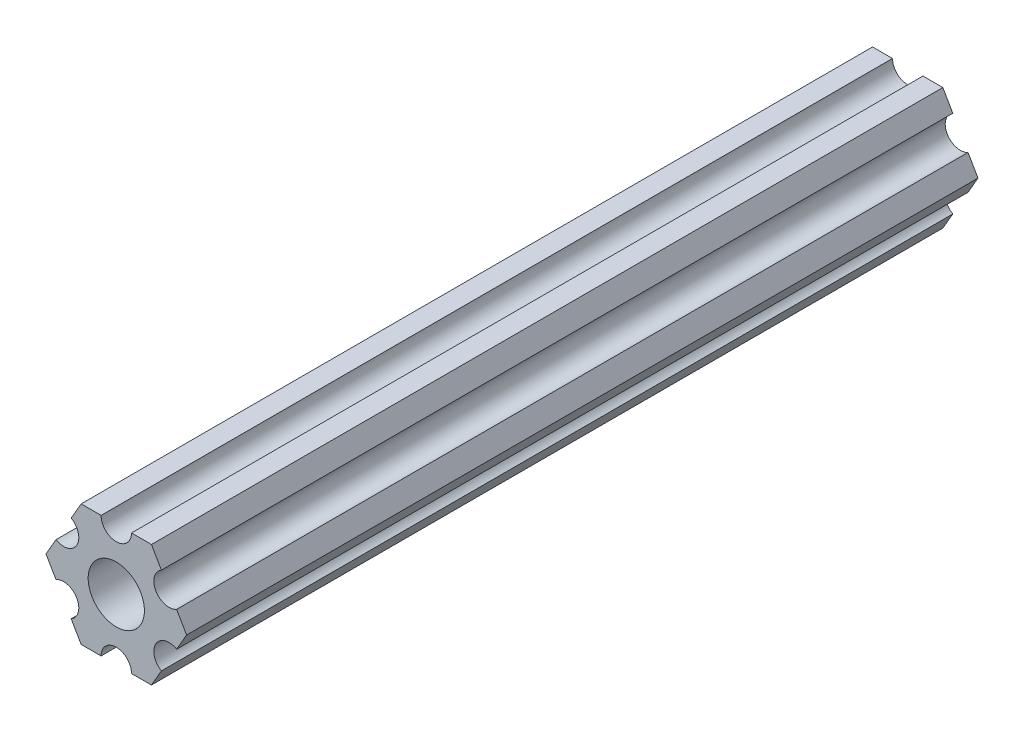
ISO-10303-21;
HEADER;
FILE_DESCRIPTION(('STEP AP214'),'2;1');
FILE_NAME('part.step','',(''),(''),'','','');
FILE_SCHEMA(('AUTOMOTIVE_DESIGN { 1 0 10303 214 1 1 1 1 }'));
ENDSEC;
DATA;
#1=APPLICATION_CONTEXT('core data for automotive mechanical design processes');
#2=APPLICATION_PROTOCOL_DEFINITION('international standard','automotive_design',2000,#1);
#3=PRODUCT_CONTEXT('',#1,'mechanical');
#4=PRODUCT('Part','Part','',(#3));
#5=PRODUCT_RELATED_PRODUCT_CATEGORY('part','',(#4));
#6=PRODUCT_DEFINITION_FORMATION('','',#4);
#7=PRODUCT_DEFINITION_CONTEXT('part definition',#1,'design');
#8=PRODUCT_DEFINITION('design','',#6,#7);
#9=PRODUCT_DEFINITION_SHAPE('','',#8);
#10=(LENGTH_UNIT() NAMED_UNIT(*) SI_UNIT(.MILLI.,.METRE.));
#11=(NAMED_UNIT(*) PLANE_ANGLE_UNIT() SI_UNIT($,.RADIAN.));
#12=(NAMED_UNIT(*) SI_UNIT($,.STERADIAN.) SOLID_ANGLE_UNIT());
#13=UNCERTAINTY_MEASURE_WITH_UNIT(LENGTH_MEASURE(1.E-05),#10,'distance_accuracy_value','');
#14=(GEOMETRIC_REPRESENTATION_CONTEXT(3) GLOBAL_UNCERTAINTY_ASSIGNED_CONTEXT((#13)) GLOBAL_UNIT_ASSIGNED_CONTEXT((#10,
#11,#12)) REPRESENTATION_CONTEXT('',''));
#15=CARTESIAN_POINT('',(0.,0.,0.));
#16=DIRECTION('',(0.,0.,1.));
#17=DIRECTION('',(1.,0.,0.));
#18=AXIS2_PLACEMENT_3D('',#15,#16,#17);
#19=CARTESIAN_POINT('',(5.49926131403118,3.175,82.55));
#20=DIRECTION('',(0.,0.,1.));
#21=DIRECTION('',(1.,0.,0.));
#22=AXIS2_PLACEMENT_3D('',#19,#20,#21);
#23=PLANE('',#22);
#24=DIRECTION('',(0.499999999999995,0.866025403784441,0.));
#25=VECTOR('',#24,1.);
#26=CARTESIAN_POINT('',(6.29301131403117,-1.8001846714922,82.55));
#27=LINE('',#26,#25);
#28=CARTESIAN_POINT('',(6.29301131403117,-1.8001846714922,82.55));
#29=VERTEX_POINT('',#28);
#30=CARTESIAN_POINT('',(7.33234841870821,0.,82.55));
#31=VERTEX_POINT('',#30);
#32=EDGE_CURVE('E231',#29,#31,#27,.T.);
#33=ORIENTED_EDGE('',*,*,#32,.T.);
#34=DIRECTION('',(-0.500000000000001,0.866025403784438,0.));
#35=VECTOR('',#34,1.);
#36=CARTESIAN_POINT('',(7.33234841870821,0.,82.55));
#37=LINE('',#36,#35);
#38=CARTESIAN_POINT('',(6.29301131403114,1.80018467149222,82.55));
#39=VERTEX_POINT('',#38);
#40=EDGE_CURVE('E129',#31,#39,#37,.T.);
#41=ORIENTED_EDGE('',*,*,#40,.T.);
#42=CARTESIAN_POINT('',(5.49926131403118,3.175,82.55));
#43=DIRECTION('',(0.,0.,-1.));
#44=DIRECTION('',(1.,0.,0.));
#45=AXIS2_PLACEMENT_3D('',#42,#43,#44);
#46=CIRCLE('',#45,1.58749999999997);
#47=CARTESIAN_POINT('',(4.70551131403117,4.54981532850775,82.55));
#48=VERTEX_POINT('',#47);
#49=EDGE_CURVE('E276',#39,#48,#46,.T.);
#50=ORIENTED_EDGE('',*,*,#49,.T.);
#51=DIRECTION('',(-0.500000000000001,0.866025403784438,0.));
#52=VECTOR('',#51,1.);
#53=CARTESIAN_POINT('',(4.70551131403117,4.54981532850775,82.55));
#54=LINE('',#53,#52);
#55=CARTESIAN_POINT('',(3.66617420935409,6.34999999999998,82.55));
#56=VERTEX_POINT('',#55);
#57=EDGE_CURVE('E295',#48,#56,#54,.T.);
#58=ORIENTED_EDGE('',*,*,#57,.T.);
#59=DIRECTION('',(-1.,0.,0.));
#60=VECTOR('',#59,1.);
#61=CARTESIAN_POINT('',(3.66617420935409,6.34999999999998,82.55));
#62=LINE('',#61,#60);
#63=CARTESIAN_POINT('',(1.58749999999997,6.34999999999997,82.55));
#64=VERTEX_POINT('',#63);
#65=EDGE_CURVE('E292',#56,#64,#62,.T.);
#66=ORIENTED_EDGE('',*,*,#65,.T.);
#67=CARTESIAN_POINT('',(0.,6.35,82.55));
#68=DIRECTION('',(0.,0.,-1.));
#69=DIRECTION('',(1.,0.,0.));
#70=AXIS2_PLACEMENT_3D('',#67,#68,#69);
#71=CIRCLE('',#70,1.5875);
#72=CARTESIAN_POINT('',(-1.5875,6.34999999999996,82.55));
#73=VERTEX_POINT('',#72);
#74=EDGE_CURVE('E294',#64,#73,#71,.T.);
#75=ORIENTED_EDGE('',*,*,#74,.T.);
#76=DIRECTION('',(-1.,0.,0.));
#77=VECTOR('',#76,1.);
#78=CARTESIAN_POINT('',(-1.58750000000003,6.34999999999996,82.55));
#79=LINE('',#78,#77);
#80=CARTESIAN_POINT('',(-3.66617420935413,6.34999999999995,82.55));
#81=VERTEX_POINT('',#80);
#82=EDGE_CURVE('E297',#73,#81,#79,.T.);
#83=ORIENTED_EDGE('',*,*,#82,.T.);
#84=DIRECTION('',(-0.499999999999995,-0.866025403784442,0.));
#85=VECTOR('',#84,1.);
#86=CARTESIAN_POINT('',(-3.66617420935413,6.34999999999995,82.55));
#87=LINE('',#86,#85);
#88=CARTESIAN_POINT('',(-4.70551131403113,4.54981532850783,82.55));
#89=VERTEX_POINT('',#88);
#90=EDGE_CURVE('E303',#81,#89,#87,.T.);
#91=ORIENTED_EDGE('',*,*,#90,.T.);
#92=CARTESIAN_POINT('',(-5.49926131403119,3.175,82.55));
#93=DIRECTION('',(0.,0.,-1.));
#94=DIRECTION('',(1.,0.,0.));
#95=AXIS2_PLACEMENT_3D('',#92,#93,#94);
#96=CIRCLE('',#95,1.5875);
#97=CARTESIAN_POINT('',(-6.29301131403115,1.80018467149218,82.55));
#98=VERTEX_POINT('',#97);
#99=EDGE_CURVE('E305',#89,#98,#96,.T.);
#100=ORIENTED_EDGE('',*,*,#99,.T.);
#101=DIRECTION('',(-0.499999999999995,-0.866025403784442,0.));
#102=VECTOR('',#101,1.);
#103=CARTESIAN_POINT('',(-6.29301131403112,1.80018467149222,82.55));
#104=LINE('',#103,#102);
#105=CARTESIAN_POINT('',(-7.33234841870821,0.,82.55));
#106=VERTEX_POINT('',#105);
#107=EDGE_CURVE('E307',#98,#106,#104,.T.);
#108=ORIENTED_EDGE('',*,*,#107,.T.);
#109=DIRECTION('',(0.500000000000007,-0.866025403784435,0.));
#110=VECTOR('',#109,1.);
#111=CARTESIAN_POINT('',(-7.33234841870821,0.,82.55));
#112=LINE('',#111,#110);
#113=CARTESIAN_POINT('',(-6.29301131403118,-1.80018467149216,82.55));
#114=VERTEX_POINT('',#113);
#115=EDGE_CURVE('E309',#106,#114,#112,.T.);
#116=ORIENTED_EDGE('',*,*,#115,.T.);
#117=CARTESIAN_POINT('',(-5.49926131403118,-3.175,82.55));
#118=DIRECTION('',(0.,0.,-1.));
#119=DIRECTION('',(1.,0.,0.));
#120=AXIS2_PLACEMENT_3D('',#117,#118,#119);
#121=CIRCLE('',#120,1.5875);
#122=CARTESIAN_POINT('',(-4.70551131403114,-4.54981532850777,82.55));
#123=VERTEX_POINT('',#122);
#124=EDGE_CURVE('E311',#114,#123,#121,.T.);
#125=ORIENTED_EDGE('',*,*,#124,.T.);
#126=DIRECTION('',(0.500000000000007,-0.866025403784435,0.));
#127=VECTOR('',#126,1.);
#128=CARTESIAN_POINT('',(-4.70551131403116,-4.54981532850774,82.55));
#129=LINE('',#128,#127);
#130=CARTESIAN_POINT('',(-3.66617420935405,-6.35,82.55));
#131=VERTEX_POINT('',#130);
#132=EDGE_CURVE('E313',#123,#131,#129,.T.);
#133=ORIENTED_EDGE('',*,*,#132,.T.);
#134=DIRECTION('',(1.,0.,0.));
#135=VECTOR('',#134,1.);
#136=CARTESIAN_POINT('',(-3.66617420935405,-6.35,82.55));
#137=LINE('',#136,#135);
#138=CARTESIAN_POINT('',(-1.58750000000002,-6.34999999999998,82.55));
#139=VERTEX_POINT('',#138);
#140=EDGE_CURVE('E315',#131,#139,#137,.T.);
#141=ORIENTED_EDGE('',*,*,#140,.T.);
#142=CARTESIAN_POINT('',(0.,-6.34999999999996,82.55));
#143=DIRECTION('',(0.,0.,-1.));
#144=DIRECTION('',(1.,0.,0.));
#145=AXIS2_PLACEMENT_3D('',#142,#143,#144);
#146=CIRCLE('',#145,1.5875);
#147=CARTESIAN_POINT('',(1.58749999999998,-6.34999999999995,82.55));
#148=VERTEX_POINT('',#147);
#149=EDGE_CURVE('E178',#139,#148,#146,.T.);
#150=ORIENTED_EDGE('',*,*,#149,.T.);
#151=DIRECTION('',(1.,0.,0.));
#152=VECTOR('',#151,1.);
#153=CARTESIAN_POINT('',(1.58749999999998,-6.34999999999995,82.55));
#154=LINE('',#153,#152);
#155=CARTESIAN_POINT('',(3.66617420935418,-6.34999999999992,82.55));
#156=VERTEX_POINT('',#155);
#157=EDGE_CURVE('E172',#148,#156,#154,.T.);
#158=ORIENTED_EDGE('',*,*,#157,.T.);
#159=DIRECTION('',(0.499999999999995,0.866025403784442,0.));
#160=VECTOR('',#159,1.);
#161=CARTESIAN_POINT('',(3.66617420935418,-6.34999999999992,82.55));
#162=LINE('',#161,#160);
#163=CARTESIAN_POINT('',(4.70551131403118,-4.5498153285078,82.55));
#164=VERTEX_POINT('',#163);
#165=EDGE_CURVE('E176',#156,#164,#162,.T.);
#166=ORIENTED_EDGE('',*,*,#165,.T.);
#167=CARTESIAN_POINT('',(5.49926131403115,-3.17499999999999,82.55));
#168=DIRECTION('',(0.,0.,-1.));
#169=DIRECTION('',(1.,0.,0.));
#170=AXIS2_PLACEMENT_3D('',#167,#168,#169);
#171=CIRCLE('',#170,1.5875);
#172=EDGE_CURVE('E56',#164,#29,#171,.T.);
#173=ORIENTED_EDGE('',*,*,#172,.T.);
#174=EDGE_LOOP('',(#33,#41,#50,#58,#66,#75,#83,#91,#100,#108,#116,#125,#133,#141,#150,#158,#166,#173));
#175=FACE_BOUND('',#174,.T.);
#176=CARTESIAN_POINT('',(0.,0.,82.55));
#177=DIRECTION('',(0.,0.,1.));
#178=DIRECTION('',(1.,0.,0.));
#179=AXIS2_PLACEMENT_3D('',#176,#177,#178);
#180=CIRCLE('',#179,2.9337);
#181=CARTESIAN_POINT('',(2.9337,0.,82.55));
#182=VERTEX_POINT('',#181);
#183=EDGE_CURVE('E200',#182,#182,#180,.T.);
#184=ORIENTED_EDGE('',*,*,#183,.F.);
#185=EDGE_LOOP('',(#184));
#186=FACE_BOUND('',#185,.T.);
#187=ADVANCED_FACE('F39',(#175,#186),#23,.T.);
#188=CARTESIAN_POINT('',(5.49926131403118,3.175,0.));
#189=DIRECTION('',(0.,0.,1.));
#190=DIRECTION('',(1.,0.,0.));
#191=AXIS2_PLACEMENT_3D('',#188,#189,#190);
#192=PLANE('',#191);
#193=DIRECTION('',(0.499999999999995,0.866025403784441,0.));
#194=VECTOR('',#193,1.);
#195=CARTESIAN_POINT('',(6.29301131403117,-1.8001846714922,0.));
#196=LINE('',#195,#194);
#197=CARTESIAN_POINT('',(6.29301131403117,-1.8001846714922,0.));
#198=VERTEX_POINT('',#197);
#199=CARTESIAN_POINT('',(7.33234841870821,0.,0.));
#200=VERTEX_POINT('',#199);
#201=EDGE_CURVE('E196',#198,#200,#196,.T.);
#202=ORIENTED_EDGE('',*,*,#201,.F.);
#203=CARTESIAN_POINT('',(5.49926131403115,-3.17499999999999,0.));
#204=DIRECTION('',(0.,0.,-1.));
#205=DIRECTION('',(1.,0.,0.));
#206=AXIS2_PLACEMENT_3D('',#203,#204,#205);
#207=CIRCLE('',#206,1.5875);
#208=CARTESIAN_POINT('',(4.70551131403118,-4.5498153285078,0.));
#209=VERTEX_POINT('',#208);
#210=EDGE_CURVE('E121',#209,#198,#207,.T.);
#211=ORIENTED_EDGE('',*,*,#210,.F.);
#212=DIRECTION('',(0.499999999999995,0.866025403784442,0.));
#213=VECTOR('',#212,1.);
#214=CARTESIAN_POINT('',(3.66617420935418,-6.34999999999992,0.));
#215=LINE('',#214,#213);
#216=CARTESIAN_POINT('',(3.66617420935418,-6.34999999999992,0.));
#217=VERTEX_POINT('',#216);
#218=EDGE_CURVE('E115',#217,#209,#215,.T.);
#219=ORIENTED_EDGE('',*,*,#218,.F.);
#220=DIRECTION('',(1.,0.,0.));
#221=VECTOR('',#220,1.);
#222=CARTESIAN_POINT('',(1.58749999999998,-6.34999999999995,0.));
#223=LINE('',#222,#221);
#224=CARTESIAN_POINT('',(1.58749999999998,-6.34999999999995,0.));
#225=VERTEX_POINT('',#224);
#226=EDGE_CURVE('E186',#225,#217,#223,.T.);
#227=ORIENTED_EDGE('',*,*,#226,.F.);
#228=CARTESIAN_POINT('',(0.,-6.34999999999996,0.));
#229=DIRECTION('',(0.,0.,-1.));
#230=DIRECTION('',(1.,0.,0.));
#231=AXIS2_PLACEMENT_3D('',#228,#229,#230);
#232=CIRCLE('',#231,1.5875);
#233=CARTESIAN_POINT('',(-1.58750000000002,-6.34999999999998,0.));
#234=VERTEX_POINT('',#233);
#235=EDGE_CURVE('E226',#234,#225,#232,.T.);
#236=ORIENTED_EDGE('',*,*,#235,.F.);
#237=DIRECTION('',(1.,0.,0.));
#238=VECTOR('',#237,1.);
#239=CARTESIAN_POINT('',(-3.66617420935405,-6.35,0.));
#240=LINE('',#239,#238);
#241=CARTESIAN_POINT('',(-3.66617420935405,-6.35,0.));
#242=VERTEX_POINT('',#241);
#243=EDGE_CURVE('E224',#242,#234,#240,.T.);
#244=ORIENTED_EDGE('',*,*,#243,.F.);
#245=DIRECTION('',(0.500000000000007,-0.866025403784435,0.));
#246=VECTOR('',#245,1.);
#247=CARTESIAN_POINT('',(-4.70551131403116,-4.54981532850774,0.));
#248=LINE('',#247,#246);
#249=CARTESIAN_POINT('',(-4.70551131403114,-4.54981532850777,0.));
#250=VERTEX_POINT('',#249);
#251=EDGE_CURVE('E222',#250,#242,#248,.T.);
#252=ORIENTED_EDGE('',*,*,#251,.F.);
#253=CARTESIAN_POINT('',(-5.49926131403118,-3.175,0.));
#254=DIRECTION('',(0.,0.,-1.));
#255=DIRECTION('',(1.,0.,0.));
#256=AXIS2_PLACEMENT_3D('',#253,#254,#255);
#257=CIRCLE('',#256,1.5875);
#258=CARTESIAN_POINT('',(-6.29301131403118,-1.80018467149216,0.));
#259=VERTEX_POINT('',#258);
#260=EDGE_CURVE('E220',#259,#250,#257,.T.);
#261=ORIENTED_EDGE('',*,*,#260,.F.);
#262=DIRECTION('',(0.500000000000007,-0.866025403784435,0.));
#263=VECTOR('',#262,1.);
#264=CARTESIAN_POINT('',(-7.33234841870821,0.,0.));
#265=LINE('',#264,#263);
#266=CARTESIAN_POINT('',(-7.33234841870821,0.,0.));
#267=VERTEX_POINT('',#266);
#268=EDGE_CURVE('E218',#267,#259,#265,.T.);
#269=ORIENTED_EDGE('',*,*,#268,.F.);
#270=DIRECTION('',(-0.499999999999995,-0.866025403784442,0.));
#271=VECTOR('',#270,1.);
#272=CARTESIAN_POINT('',(-6.29301131403112,1.80018467149222,0.));
#273=LINE('',#272,#271);
#274=CARTESIAN_POINT('',(-6.29301131403115,1.80018467149218,0.));
#275=VERTEX_POINT('',#274);
#276=EDGE_CURVE('E216',#275,#267,#273,.T.);
#277=ORIENTED_EDGE('',*,*,#276,.F.);
#278=CARTESIAN_POINT('',(-5.49926131403119,3.175,0.));
#279=DIRECTION('',(0.,0.,-1.));
#280=DIRECTION('',(1.,0.,0.));
#281=AXIS2_PLACEMENT_3D('',#278,#279,#280);
#282=CIRCLE('',#281,1.5875);
#283=CARTESIAN_POINT('',(-4.70551131403113,4.54981532850783,0.));
#284=VERTEX_POINT('',#283);
#285=EDGE_CURVE('E214',#284,#275,#282,.T.);
#286=ORIENTED_EDGE('',*,*,#285,.F.);
#287=DIRECTION('',(-0.499999999999995,-0.866025403784442,0.));
#288=VECTOR('',#287,1.);
#289=CARTESIAN_POINT('',(-3.66617420935413,6.34999999999995,0.));
#290=LINE('',#289,#288);
#291=CARTESIAN_POINT('',(-3.66617420935413,6.34999999999995,0.));
#292=VERTEX_POINT('',#291);
#293=EDGE_CURVE('E212',#292,#284,#290,.T.);
#294=ORIENTED_EDGE('',*,*,#293,.F.);
#295=DIRECTION('',(-1.,0.,0.));
#296=VECTOR('',#295,1.);
#297=CARTESIAN_POINT('',(-1.58750000000003,6.34999999999996,0.));
#298=LINE('',#297,#296);
#299=CARTESIAN_POINT('',(-1.5875,6.34999999999996,0.));
#300=VERTEX_POINT('',#299);
#301=EDGE_CURVE('E210',#300,#292,#298,.T.);
#302=ORIENTED_EDGE('',*,*,#301,.F.);
#303=CARTESIAN_POINT('',(0.,6.35,0.));
#304=DIRECTION('',(0.,0.,-1.));
#305=DIRECTION('',(1.,0.,0.));
#306=AXIS2_PLACEMENT_3D('',#303,#304,#305);
#307=CIRCLE('',#306,1.5875);
#308=CARTESIAN_POINT('',(1.58749999999997,6.34999999999997,0.));
#309=VERTEX_POINT('',#308);
#310=EDGE_CURVE('E208',#309,#300,#307,.T.);
#311=ORIENTED_EDGE('',*,*,#310,.F.);
#312=DIRECTION('',(-1.,0.,0.));
#313=VECTOR('',#312,1.);
#314=CARTESIAN_POINT('',(3.66617420935409,6.34999999999998,0.));
#315=LINE('',#314,#313);
#316=CARTESIAN_POINT('',(3.66617420935409,6.34999999999998,0.));
#317=VERTEX_POINT('',#316);
#318=EDGE_CURVE('E206',#317,#309,#315,.T.);
#319=ORIENTED_EDGE('',*,*,#318,.F.);
#320=DIRECTION('',(-0.500000000000001,0.866025403784438,0.));
#321=VECTOR('',#320,1.);
#322=CARTESIAN_POINT('',(4.70551131403117,4.54981532850775,0.));
#323=LINE('',#322,#321);
#324=CARTESIAN_POINT('',(4.70551131403117,4.54981532850775,0.));
#325=VERTEX_POINT('',#324);
#326=EDGE_CURVE('E204',#325,#317,#323,.T.);
#327=ORIENTED_EDGE('',*,*,#326,.F.);
#328=CARTESIAN_POINT('',(5.49926131403118,3.175,0.));
#329=DIRECTION('',(0.,0.,-1.));
#330=DIRECTION('',(1.,0.,0.));
#331=AXIS2_PLACEMENT_3D('',#328,#329,#330);
#332=CIRCLE('',#331,1.58749999999997);
#333=CARTESIAN_POINT('',(6.29301131403114,1.80018467149222,0.));
#334=VERTEX_POINT('',#333);
#335=EDGE_CURVE('E202',#334,#325,#332,.T.);
#336=ORIENTED_EDGE('',*,*,#335,.F.);
#337=DIRECTION('',(-0.500000000000001,0.866025403784438,0.));
#338=VECTOR('',#337,1.);
#339=CARTESIAN_POINT('',(7.33234841870821,0.,0.));
#340=LINE('',#339,#338);
#341=EDGE_CURVE('E199',#200,#334,#340,.T.);
#342=ORIENTED_EDGE('',*,*,#341,.F.);
#343=EDGE_LOOP('',(#202,#211,#219,#227,#236,#244,#252,#261,#269,#277,#286,#294,#302,#311,#319,
#327,#336,#342));
#344=FACE_BOUND('',#343,.T.);
#345=CARTESIAN_POINT('',(0.,0.,0.));
#346=DIRECTION('',(0.,0.,1.));
#347=DIRECTION('',(1.,0.,0.));
#348=AXIS2_PLACEMENT_3D('',#345,#346,#347);
#349=CIRCLE('',#348,2.9337);
#350=CARTESIAN_POINT('',(2.9337,0.,0.));
#351=VERTEX_POINT('',#350);
#352=EDGE_CURVE('E540',#351,#351,#349,.T.);
#353=ORIENTED_EDGE('',*,*,#352,.T.);
#354=EDGE_LOOP('',(#353));
#355=FACE_BOUND('',#354,.T.);
#356=ADVANCED_FACE('F280',(#344,#355),#192,.F.);
#357=CARTESIAN_POINT('',(6.29301131403117,-1.8001846714922,82.55));
#358=DIRECTION('',(-0.866025403784441,0.499999999999995,0.));
#359=DIRECTION('',(-0.499999999999995,-0.866025403784442,0.));
#360=AXIS2_PLACEMENT_3D('',#357,#358,#359);
#361=PLANE('',#360);
#362=ORIENTED_EDGE('',*,*,#201,.T.);
#363=DIRECTION('',(0.,0.,-1.));
#364=VECTOR('',#363,1.);
#365=CARTESIAN_POINT('',(7.33234841870821,0.,82.55));
#366=LINE('',#365,#364);
#367=EDGE_CURVE('E11',#31,#200,#366,.T.);
#368=ORIENTED_EDGE('',*,*,#367,.F.);
#369=ORIENTED_EDGE('',*,*,#32,.F.);
#370=DIRECTION('',(0.,0.,-1.));
#371=VECTOR('',#370,1.);
#372=CARTESIAN_POINT('',(6.29301131403117,-1.8001846714922,82.55));
#373=LINE('',#372,#371);
#374=EDGE_CURVE('E192',#29,#198,#373,.T.);
#375=ORIENTED_EDGE('',*,*,#374,.T.);
#376=EDGE_LOOP('',(#362,#368,#369,#375));
#377=FACE_BOUND('',#376,.T.);
#378=ADVANCED_FACE('F41',(#377),#361,.F.);
#379=CARTESIAN_POINT('',(7.33234841870821,0.,82.55));
#380=DIRECTION('',(-0.866025403784438,-0.500000000000001,0.));
#381=DIRECTION('',(0.500000000000001,-0.866025403784438,0.));
#382=AXIS2_PLACEMENT_3D('',#379,#380,#381);
#383=PLANE('',#382);
#384=ORIENTED_EDGE('',*,*,#341,.T.);
#385=DIRECTION('',(0.,0.,-1.));
#386=VECTOR('',#385,1.);
#387=CARTESIAN_POINT('',(6.29301131403114,1.80018467149222,82.55));
#388=LINE('',#387,#386);
#389=EDGE_CURVE('E48',#39,#334,#388,.T.);
#390=ORIENTED_EDGE('',*,*,#389,.F.);
#391=ORIENTED_EDGE('',*,*,#40,.F.);
#392=ORIENTED_EDGE('',*,*,#367,.T.);
#393=EDGE_LOOP('',(#384,#390,#391,#392));
#394=FACE_BOUND('',#393,.T.);
#395=ADVANCED_FACE('F349',(#394),#383,.F.);
#396=CARTESIAN_POINT('',(5.49926131403118,3.175,82.55));
#397=DIRECTION('',(0.,0.,-1.));
#398=DIRECTION('',(-1.,0.,0.));
#399=AXIS2_PLACEMENT_3D('',#396,#397,#398);
#400=CYLINDRICAL_SURFACE('',#399,1.58749999999997);
#401=ORIENTED_EDGE('',*,*,#335,.T.);
#402=DIRECTION('',(0.,0.,-1.));
#403=VECTOR('',#402,1.);
#404=CARTESIAN_POINT('',(4.70551131403117,4.54981532850775,82.55));
#405=LINE('',#404,#403);
#406=EDGE_CURVE('E268',#48,#325,#405,.T.);
#407=ORIENTED_EDGE('',*,*,#406,.F.);
#408=ORIENTED_EDGE('',*,*,#49,.F.);
#409=ORIENTED_EDGE('',*,*,#389,.T.);
#410=EDGE_LOOP('',(#401,#407,#408,#409));
#411=FACE_BOUND('',#410,.T.);
#412=ADVANCED_FACE('F274',(#411),#400,.F.);
#413=CARTESIAN_POINT('',(4.70551131403117,4.54981532850775,82.55));
#414=DIRECTION('',(-0.866025403784438,-0.500000000000001,0.));
#415=DIRECTION('',(0.500000000000001,-0.866025403784438,0.));
#416=AXIS2_PLACEMENT_3D('',#413,#414,#415);
#417=PLANE('',#416);
#418=ORIENTED_EDGE('',*,*,#326,.T.);
#419=DIRECTION('',(0.,0.,-1.));
#420=VECTOR('',#419,1.);
#421=CARTESIAN_POINT('',(3.66617420935409,6.34999999999998,82.55));
#422=LINE('',#421,#420);
#423=EDGE_CURVE('E265',#56,#317,#422,.T.);
#424=ORIENTED_EDGE('',*,*,#423,.F.);
#425=ORIENTED_EDGE('',*,*,#57,.F.);
#426=ORIENTED_EDGE('',*,*,#406,.T.);
#427=EDGE_LOOP('',(#418,#424,#425,#426));
#428=FACE_BOUND('',#427,.T.);
#429=ADVANCED_FACE('F286',(#428),#417,.F.);
#430=CARTESIAN_POINT('',(3.66617420935409,6.34999999999998,82.55));
#431=DIRECTION('',(0.,-1.,0.));
#432=DIRECTION('',(1.,0.,0.));
#433=AXIS2_PLACEMENT_3D('',#430,#431,#432);
#434=PLANE('',#433);
#435=ORIENTED_EDGE('',*,*,#318,.T.);
#436=DIRECTION('',(0.,0.,-1.));
#437=VECTOR('',#436,1.);
#438=CARTESIAN_POINT('',(1.58749999999997,6.34999999999997,82.55));
#439=LINE('',#438,#437);
#440=EDGE_CURVE('E262',#64,#309,#439,.T.);
#441=ORIENTED_EDGE('',*,*,#440,.F.);
#442=ORIENTED_EDGE('',*,*,#65,.F.);
#443=ORIENTED_EDGE('',*,*,#423,.T.);
#444=EDGE_LOOP('',(#435,#441,#442,#443));
#445=FACE_BOUND('',#444,.T.);
#446=ADVANCED_FACE('F290',(#445),#434,.F.);
#447=CARTESIAN_POINT('',(0.,6.35,82.55));
#448=DIRECTION('',(0.,0.,-1.));
#449=DIRECTION('',(-1.,0.,0.));
#450=AXIS2_PLACEMENT_3D('',#447,#448,#449);
#451=CYLINDRICAL_SURFACE('',#450,1.5875);
#452=ORIENTED_EDGE('',*,*,#310,.T.);
#453=DIRECTION('',(0.,0.,-1.));
#454=VECTOR('',#453,1.);
#455=CARTESIAN_POINT('',(-1.5875,6.34999999999996,82.55));
#456=LINE('',#455,#454);
#457=EDGE_CURVE('E259',#73,#300,#456,.T.);
#458=ORIENTED_EDGE('',*,*,#457,.F.);
#459=ORIENTED_EDGE('',*,*,#74,.F.);
#460=ORIENTED_EDGE('',*,*,#440,.T.);
#461=EDGE_LOOP('',(#452,#458,#459,#460));
#462=FACE_BOUND('',#461,.T.);
#463=ADVANCED_FACE('F362',(#462),#451,.F.);
#464=CARTESIAN_POINT('',(-1.58750000000003,6.34999999999996,82.55));
#465=DIRECTION('',(0.,-1.,0.));
#466=DIRECTION('',(1.,0.,0.));
#467=AXIS2_PLACEMENT_3D('',#464,#465,#466);
#468=PLANE('',#467);
#469=ORIENTED_EDGE('',*,*,#301,.T.);
#470=DIRECTION('',(0.,0.,-1.));
#471=VECTOR('',#470,1.);
#472=CARTESIAN_POINT('',(-3.66617420935413,6.34999999999995,82.55));
#473=LINE('',#472,#471);
#474=EDGE_CURVE('E256',#81,#292,#473,.T.);
#475=ORIENTED_EDGE('',*,*,#474,.F.);
#476=ORIENTED_EDGE('',*,*,#82,.F.);
#477=ORIENTED_EDGE('',*,*,#457,.T.);
#478=EDGE_LOOP('',(#469,#475,#476,#477));
#479=FACE_BOUND('',#478,.T.);
#480=ADVANCED_FACE('F365',(#479),#468,.F.);
#481=CARTESIAN_POINT('',(-3.66617420935413,6.34999999999995,82.55));
#482=DIRECTION('',(0.866025403784442,-0.499999999999995,0.));
#483=DIRECTION('',(0.499999999999995,0.866025403784442,0.));
#484=AXIS2_PLACEMENT_3D('',#481,#482,#483);
#485=PLANE('',#484);
#486=ORIENTED_EDGE('',*,*,#293,.T.);
#487=DIRECTION('',(0.,0.,-1.));
#488=VECTOR('',#487,1.);
#489=CARTESIAN_POINT('',(-4.70551131403113,4.54981532850783,82.55));
#490=LINE('',#489,#488);
#491=EDGE_CURVE('E253',#89,#284,#490,.T.);
#492=ORIENTED_EDGE('',*,*,#491,.F.);
#493=ORIENTED_EDGE('',*,*,#90,.F.);
#494=ORIENTED_EDGE('',*,*,#474,.T.);
#495=EDGE_LOOP('',(#486,#492,#493,#494));
#496=FACE_BOUND('',#495,.T.);
#497=ADVANCED_FACE('F369',(#496),#485,.F.);
#498=CARTESIAN_POINT('',(-5.49926131403119,3.175,82.55));
#499=DIRECTION('',(0.,0.,-1.));
#500=DIRECTION('',(-1.,0.,0.));
#501=AXIS2_PLACEMENT_3D('',#498,#499,#500);
#502=CYLINDRICAL_SURFACE('',#501,1.5875);
#503=ORIENTED_EDGE('',*,*,#285,.T.);
#504=DIRECTION('',(0.,0.,-1.));
#505=VECTOR('',#504,1.);
#506=CARTESIAN_POINT('',(-6.29301131403115,1.80018467149218,82.55));
#507=LINE('',#506,#505);
#508=EDGE_CURVE('E250',#98,#275,#507,.T.);
#509=ORIENTED_EDGE('',*,*,#508,.F.);
#510=ORIENTED_EDGE('',*,*,#99,.F.);
#511=ORIENTED_EDGE('',*,*,#491,.T.);
#512=EDGE_LOOP('',(#503,#509,#510,#511));
#513=FACE_BOUND('',#512,.T.);
#514=ADVANCED_FACE('F373',(#513),#502,.F.);
#515=CARTESIAN_POINT('',(-6.29301131403112,1.80018467149222,82.55));
#516=DIRECTION('',(0.866025403784442,-0.499999999999995,0.));
#517=DIRECTION('',(0.499999999999995,0.866025403784442,0.));
#518=AXIS2_PLACEMENT_3D('',#515,#516,#517);
#519=PLANE('',#518);
#520=ORIENTED_EDGE('',*,*,#276,.T.);
#521=DIRECTION('',(0.,0.,-1.));
#522=VECTOR('',#521,1.);
#523=CARTESIAN_POINT('',(-7.33234841870821,0.,82.55));
#524=LINE('',#523,#522);
#525=EDGE_CURVE('E247',#106,#267,#524,.T.);
#526=ORIENTED_EDGE('',*,*,#525,.F.);
#527=ORIENTED_EDGE('',*,*,#107,.F.);
#528=ORIENTED_EDGE('',*,*,#508,.T.);
#529=EDGE_LOOP('',(#520,#526,#527,#528));
#530=FACE_BOUND('',#529,.T.);
#531=ADVANCED_FACE('F377',(#530),#519,.F.);
#532=CARTESIAN_POINT('',(-7.33234841870821,0.,82.55));
#533=DIRECTION('',(0.866025403784435,0.500000000000007,0.));
#534=DIRECTION('',(-0.500000000000007,0.866025403784435,0.));
#535=AXIS2_PLACEMENT_3D('',#532,#533,#534);
#536=PLANE('',#535);
#537=ORIENTED_EDGE('',*,*,#268,.T.);
#538=DIRECTION('',(0.,0.,-1.));
#539=VECTOR('',#538,1.);
#540=CARTESIAN_POINT('',(-6.29301131403118,-1.80018467149216,82.55));
#541=LINE('',#540,#539);
#542=EDGE_CURVE('E244',#114,#259,#541,.T.);
#543=ORIENTED_EDGE('',*,*,#542,.F.);
#544=ORIENTED_EDGE('',*,*,#115,.F.);
#545=ORIENTED_EDGE('',*,*,#525,.T.);
#546=EDGE_LOOP('',(#537,#543,#544,#545));
#547=FACE_BOUND('',#546,.T.);
#548=ADVANCED_FACE('F381',(#547),#536,.F.);
#549=CARTESIAN_POINT('',(-5.49926131403118,-3.175,82.55));
#550=DIRECTION('',(0.,0.,-1.));
#551=DIRECTION('',(-1.,0.,0.));
#552=AXIS2_PLACEMENT_3D('',#549,#550,#551);
#553=CYLINDRICAL_SURFACE('',#552,1.5875);
#554=ORIENTED_EDGE('',*,*,#260,.T.);
#555=DIRECTION('',(0.,0.,-1.));
#556=VECTOR('',#555,1.);
#557=CARTESIAN_POINT('',(-4.70551131403114,-4.54981532850777,82.55));
#558=LINE('',#557,#556);
#559=EDGE_CURVE('E241',#123,#250,#558,.T.);
#560=ORIENTED_EDGE('',*,*,#559,.F.);
#561=ORIENTED_EDGE('',*,*,#124,.F.);
#562=ORIENTED_EDGE('',*,*,#542,.T.);
#563=EDGE_LOOP('',(#554,#560,#561,#562));
#564=FACE_BOUND('',#563,.T.);
#565=ADVANCED_FACE('F385',(#564),#553,.F.);
#566=CARTESIAN_POINT('',(-4.70551131403116,-4.54981532850774,82.55));
#567=DIRECTION('',(0.866025403784434,0.500000000000007,0.));
#568=DIRECTION('',(-0.500000000000007,0.866025403784435,0.));
#569=AXIS2_PLACEMENT_3D('',#566,#567,#568);
#570=PLANE('',#569);
#571=ORIENTED_EDGE('',*,*,#251,.T.);
#572=DIRECTION('',(0.,0.,-1.));
#573=VECTOR('',#572,1.);
#574=CARTESIAN_POINT('',(-3.66617420935405,-6.35,82.55));
#575=LINE('',#574,#573);
#576=EDGE_CURVE('E238',#131,#242,#575,.T.);
#577=ORIENTED_EDGE('',*,*,#576,.F.);
#578=ORIENTED_EDGE('',*,*,#132,.F.);
#579=ORIENTED_EDGE('',*,*,#559,.T.);
#580=EDGE_LOOP('',(#571,#577,#578,#579));
#581=FACE_BOUND('',#580,.T.);
#582=ADVANCED_FACE('F389',(#581),#570,.F.);
#583=CARTESIAN_POINT('',(-3.66617420935405,-6.35,82.55));
#584=DIRECTION('',(0.,1.,0.));
#585=DIRECTION('',(-1.,0.,0.));
#586=AXIS2_PLACEMENT_3D('',#583,#584,#585);
#587=PLANE('',#586);
#588=ORIENTED_EDGE('',*,*,#243,.T.);
#589=DIRECTION('',(0.,0.,-1.));
#590=VECTOR('',#589,1.);
#591=CARTESIAN_POINT('',(-1.58750000000002,-6.34999999999998,82.55));
#592=LINE('',#591,#590);
#593=EDGE_CURVE('E235',#139,#234,#592,.T.);
#594=ORIENTED_EDGE('',*,*,#593,.F.);
#595=ORIENTED_EDGE('',*,*,#140,.F.);
#596=ORIENTED_EDGE('',*,*,#576,.T.);
#597=EDGE_LOOP('',(#588,#594,#595,#596));
#598=FACE_BOUND('',#597,.T.);
#599=ADVANCED_FACE('F321',(#598),#587,.F.);
#600=CARTESIAN_POINT('',(0.,-6.34999999999996,82.55));
#601=DIRECTION('',(0.,0.,-1.));
#602=DIRECTION('',(-1.,0.,0.));
#603=AXIS2_PLACEMENT_3D('',#600,#601,#602);
#604=CYLINDRICAL_SURFACE('',#603,1.5875);
#605=ORIENTED_EDGE('',*,*,#235,.T.);
#606=DIRECTION('',(0.,0.,-1.));
#607=VECTOR('',#606,1.);
#608=CARTESIAN_POINT('',(1.58749999999998,-6.34999999999995,82.55));
#609=LINE('',#608,#607);
#610=EDGE_CURVE('E187',#148,#225,#609,.T.);
#611=ORIENTED_EDGE('',*,*,#610,.F.);
#612=ORIENTED_EDGE('',*,*,#149,.F.);
#613=ORIENTED_EDGE('',*,*,#593,.T.);
#614=EDGE_LOOP('',(#605,#611,#612,#613));
#615=FACE_BOUND('',#614,.T.);
#616=ADVANCED_FACE('F325',(#615),#604,.F.);
#617=CARTESIAN_POINT('',(1.58749999999998,-6.34999999999995,82.55));
#618=DIRECTION('',(0.,1.,0.));
#619=DIRECTION('',(-1.,0.,0.));
#620=AXIS2_PLACEMENT_3D('',#617,#618,#619);
#621=PLANE('',#620);
#622=ORIENTED_EDGE('',*,*,#226,.T.);
#623=DIRECTION('',(0.,0.,-1.));
#624=VECTOR('',#623,1.);
#625=CARTESIAN_POINT('',(3.66617420935418,-6.34999999999992,82.55));
#626=LINE('',#625,#624);
#627=EDGE_CURVE('E183',#156,#217,#626,.T.);
#628=ORIENTED_EDGE('',*,*,#627,.F.);
#629=ORIENTED_EDGE('',*,*,#157,.F.);
#630=ORIENTED_EDGE('',*,*,#610,.T.);
#631=EDGE_LOOP('',(#622,#628,#629,#630));
#632=FACE_BOUND('',#631,.T.);
#633=ADVANCED_FACE('F184',(#632),#621,.F.);
#634=CARTESIAN_POINT('',(3.66617420935418,-6.34999999999992,82.55));
#635=DIRECTION('',(-0.866025403784442,0.499999999999995,0.));
#636=DIRECTION('',(-0.499999999999995,-0.866025403784442,0.));
#637=AXIS2_PLACEMENT_3D('',#634,#635,#636);
#638=PLANE('',#637);
#639=ORIENTED_EDGE('',*,*,#218,.T.);
#640=DIRECTION('',(0.,0.,-1.));
#641=VECTOR('',#640,1.);
#642=CARTESIAN_POINT('',(4.70551131403118,-4.5498153285078,82.55));
#643=LINE('',#642,#641);
#644=EDGE_CURVE('E188',#164,#209,#643,.T.);
#645=ORIENTED_EDGE('',*,*,#644,.F.);
#646=ORIENTED_EDGE('',*,*,#165,.F.);
#647=ORIENTED_EDGE('',*,*,#627,.T.);
#648=EDGE_LOOP('',(#639,#645,#646,#647));
#649=FACE_BOUND('',#648,.T.);
#650=ADVANCED_FACE('F190',(#649),#638,.F.);
#651=CARTESIAN_POINT('',(5.49926131403115,-3.17499999999999,82.55));
#652=DIRECTION('',(0.,0.,-1.));
#653=DIRECTION('',(-1.,0.,0.));
#654=AXIS2_PLACEMENT_3D('',#651,#652,#653);
#655=CYLINDRICAL_SURFACE('',#654,1.5875);
#656=ORIENTED_EDGE('',*,*,#210,.T.);
#657=ORIENTED_EDGE('',*,*,#374,.F.);
#658=ORIENTED_EDGE('',*,*,#172,.F.);
#659=ORIENTED_EDGE('',*,*,#644,.T.);
#660=EDGE_LOOP('',(#656,#657,#658,#659));
#661=FACE_BOUND('',#660,.T.);
#662=ADVANCED_FACE('F329',(#661),#655,.F.);
#663=CARTESIAN_POINT('',(0.,0.,82.55));
#664=DIRECTION('',(0.,0.,-1.));
#665=DIRECTION('',(-1.,0.,0.));
#666=AXIS2_PLACEMENT_3D('',#663,#664,#665);
#667=CYLINDRICAL_SURFACE('',#666,2.9337);
#668=ORIENTED_EDGE('',*,*,#183,.T.);
#669=EDGE_LOOP('',(#668));
#670=FACE_BOUND('',#669,.T.);
#671=ORIENTED_EDGE('',*,*,#352,.F.);
#672=EDGE_LOOP('',(#671));
#673=FACE_BOUND('',#672,.T.);
#674=ADVANCED_FACE('F331',(#670,#673),#667,.F.);
#675=CLOSED_SHELL('',(#187,#356,#378,#395,#412,#429,#446,#463,#480,#497,#514,#531,#548,#565,
#582,#599,#616,#633,#650,#662,#674));
#676=MANIFOLD_SOLID_BREP('B2',#675);
#677=ADVANCED_BREP_SHAPE_REPRESENTATION('',(#18,#676),#14);
#678=SHAPE_DEFINITION_REPRESENTATION(#9,#677);
ENDSEC;
END-ISO-10303-21;
